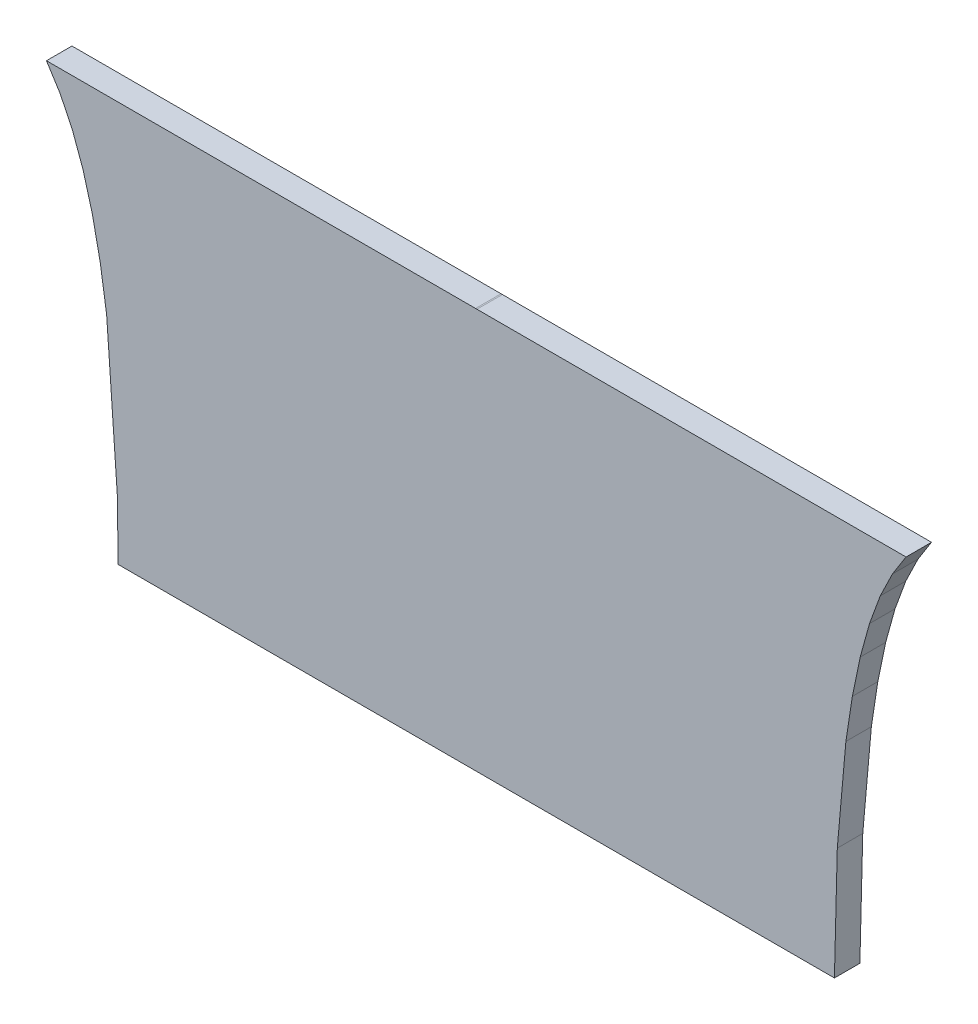
ISO-10303-21;
HEADER;
FILE_DESCRIPTION(('STEP AP214'),'2;1');
FILE_NAME('part.step','',(''),(''),'','','');
FILE_SCHEMA(('AUTOMOTIVE_DESIGN { 1 0 10303 214 1 1 1 1 }'));
ENDSEC;
DATA;
#1=APPLICATION_CONTEXT('core data for automotive mechanical design processes');
#2=APPLICATION_PROTOCOL_DEFINITION('international standard','automotive_design',2000,#1);
#3=PRODUCT_CONTEXT('',#1,'mechanical');
#4=PRODUCT('Part','Part','',(#3));
#5=PRODUCT_RELATED_PRODUCT_CATEGORY('part','',(#4));
#6=PRODUCT_DEFINITION_FORMATION('','',#4);
#7=PRODUCT_DEFINITION_CONTEXT('part definition',#1,'design');
#8=PRODUCT_DEFINITION('design','',#6,#7);
#9=PRODUCT_DEFINITION_SHAPE('','',#8);
#10=(LENGTH_UNIT() NAMED_UNIT(*) SI_UNIT(.MILLI.,.METRE.));
#11=(NAMED_UNIT(*) PLANE_ANGLE_UNIT() SI_UNIT($,.RADIAN.));
#12=(NAMED_UNIT(*) SI_UNIT($,.STERADIAN.) SOLID_ANGLE_UNIT());
#13=UNCERTAINTY_MEASURE_WITH_UNIT(LENGTH_MEASURE(1.E-05),#10,'distance_accuracy_value','');
#14=(GEOMETRIC_REPRESENTATION_CONTEXT(3) GLOBAL_UNCERTAINTY_ASSIGNED_CONTEXT((#13)) GLOBAL_UNIT_ASSIGNED_CONTEXT((#10,
#11,#12)) REPRESENTATION_CONTEXT('',''));
#15=CARTESIAN_POINT('',(0.,0.,0.));
#16=DIRECTION('',(0.,0.,1.));
#17=DIRECTION('',(1.,0.,0.));
#18=AXIS2_PLACEMENT_3D('',#15,#16,#17);
#19=CARTESIAN_POINT('',(68.4000015258789,42.5709991455078,0.));
#20=DIRECTION('',(0.,1.,0.));
#21=DIRECTION('',(1.,0.,0.));
#22=AXIS2_PLACEMENT_3D('',#19,#20,#21);
#23=PLANE('',#22);
#24=DIRECTION('',(1.,0.,0.));
#25=VECTOR('',#24,1.);
#26=CARTESIAN_POINT('',(68.4000015258789,42.5709991455078,0.03556));
#27=LINE('',#26,#25);
#28=CARTESIAN_POINT('',(68.4000015258789,42.5709991455078,0.03556));
#29=VERTEX_POINT('',#28);
#30=CARTESIAN_POINT('',(69.4000015258789,42.5709991455078,0.03556));
#31=VERTEX_POINT('',#30);
#32=EDGE_CURVE('E11',#29,#31,#27,.T.);
#33=ORIENTED_EDGE('',*,*,#32,.F.);
#34=DIRECTION('',(0.,0.,1.));
#35=VECTOR('',#34,1.);
#36=CARTESIAN_POINT('',(68.4000015258789,42.5709991455078,0.));
#37=LINE('',#36,#35);
#38=CARTESIAN_POINT('',(68.4000015258789,42.5709991455078,0.));
#39=VERTEX_POINT('',#38);
#40=EDGE_CURVE('E24',#39,#29,#37,.T.);
#41=ORIENTED_EDGE('',*,*,#40,.F.);
#42=DIRECTION('',(1.,0.,0.));
#43=VECTOR('',#42,1.);
#44=CARTESIAN_POINT('',(68.4000015258789,42.5709991455078,0.));
#45=LINE('',#44,#43);
#46=CARTESIAN_POINT('',(69.4000015258789,42.5709991455078,0.));
#47=VERTEX_POINT('',#46);
#48=EDGE_CURVE('E311',#39,#47,#45,.T.);
#49=ORIENTED_EDGE('',*,*,#48,.T.);
#50=DIRECTION('',(0.,0.,1.));
#51=VECTOR('',#50,1.);
#52=CARTESIAN_POINT('',(69.4000015258789,42.5709991455078,0.));
#53=LINE('',#52,#51);
#54=EDGE_CURVE('E37',#47,#31,#53,.T.);
#55=ORIENTED_EDGE('',*,*,#54,.T.);
#56=EDGE_LOOP('',(#33,#41,#49,#55));
#57=FACE_BOUND('',#56,.T.);
#58=ADVANCED_FACE('F17',(#57),#23,.F.);
#59=CARTESIAN_POINT('',(68.3990020751953,42.6529998779297,0.));
#60=DIRECTION('',(0.999925730774336,0.012187408888299,0.));
#61=DIRECTION('',(0.012187408888299,-0.999925730774336,0.));
#62=AXIS2_PLACEMENT_3D('',#59,#60,#61);
#63=PLANE('',#62);
#64=DIRECTION('',(0.012187408888299,-0.999925730774336,0.));
#65=VECTOR('',#64,1.);
#66=CARTESIAN_POINT('',(68.3990020751953,42.6529998779297,0.03556));
#67=LINE('',#66,#65);
#68=CARTESIAN_POINT('',(68.3990020751953,42.6529998779297,0.03556));
#69=VERTEX_POINT('',#68);
#70=EDGE_CURVE('E307',#69,#29,#67,.T.);
#71=ORIENTED_EDGE('',*,*,#70,.F.);
#72=DIRECTION('',(0.,0.,1.));
#73=VECTOR('',#72,1.);
#74=CARTESIAN_POINT('',(68.3990020751953,42.6529998779297,0.));
#75=LINE('',#74,#73);
#76=CARTESIAN_POINT('',(68.3990020751953,42.6529998779297,0.));
#77=VERTEX_POINT('',#76);
#78=EDGE_CURVE('E305',#77,#69,#75,.T.);
#79=ORIENTED_EDGE('',*,*,#78,.F.);
#80=DIRECTION('',(0.012187408888299,-0.999925730774336,0.));
#81=VECTOR('',#80,1.);
#82=CARTESIAN_POINT('',(68.3990020751953,42.6529998779297,0.));
#83=LINE('',#82,#81);
#84=EDGE_CURVE('E303',#77,#39,#83,.T.);
#85=ORIENTED_EDGE('',*,*,#84,.T.);
#86=ORIENTED_EDGE('',*,*,#40,.T.);
#87=EDGE_LOOP('',(#71,#79,#85,#86));
#88=FACE_BOUND('',#87,.T.);
#89=ADVANCED_FACE('F314',(#88),#63,.F.);
#90=CARTESIAN_POINT('',(68.3840026855469,42.8650016784668,0.));
#91=DIRECTION('',(0.997506488728673,0.0705748180599396,0.));
#92=DIRECTION('',(0.0705748180599396,-0.997506488728673,0.));
#93=AXIS2_PLACEMENT_3D('',#90,#91,#92);
#94=PLANE('',#93);
#95=DIRECTION('',(0.0705748180599396,-0.997506488728673,0.));
#96=VECTOR('',#95,1.);
#97=CARTESIAN_POINT('',(68.3840026855469,42.8650016784668,0.03556));
#98=LINE('',#97,#96);
#99=CARTESIAN_POINT('',(68.3840026855469,42.8650016784668,0.03556));
#100=VERTEX_POINT('',#99);
#101=EDGE_CURVE('E300',#100,#69,#98,.T.);
#102=ORIENTED_EDGE('',*,*,#101,.F.);
#103=DIRECTION('',(0.,0.,1.));
#104=VECTOR('',#103,1.);
#105=CARTESIAN_POINT('',(68.3840026855469,42.8650016784668,0.));
#106=LINE('',#105,#104);
#107=CARTESIAN_POINT('',(68.3840026855469,42.8650016784668,0.));
#108=VERTEX_POINT('',#107);
#109=EDGE_CURVE('E298',#108,#100,#106,.T.);
#110=ORIENTED_EDGE('',*,*,#109,.F.);
#111=DIRECTION('',(0.0705748180599396,-0.997506488728673,0.));
#112=VECTOR('',#111,1.);
#113=CARTESIAN_POINT('',(68.3840026855469,42.8650016784668,0.));
#114=LINE('',#113,#112);
#115=EDGE_CURVE('E295',#108,#77,#114,.T.);
#116=ORIENTED_EDGE('',*,*,#115,.T.);
#117=ORIENTED_EDGE('',*,*,#78,.T.);
#118=EDGE_LOOP('',(#102,#110,#116,#117));
#119=FACE_BOUND('',#118,.T.);
#120=ADVANCED_FACE('F317',(#119),#94,.F.);
#121=CARTESIAN_POINT('',(68.375,42.9239997863769,0.));
#122=DIRECTION('',(0.98855716875994,0.150846690694003,0.));
#123=DIRECTION('',(0.150846690694003,-0.98855716875994,0.));
#124=AXIS2_PLACEMENT_3D('',#121,#122,#123);
#125=PLANE('',#124);
#126=DIRECTION('',(0.150846690694003,-0.98855716875994,0.));
#127=VECTOR('',#126,1.);
#128=CARTESIAN_POINT('',(68.375,42.9239997863769,0.03556));
#129=LINE('',#128,#127);
#130=CARTESIAN_POINT('',(68.375,42.9239997863769,0.03556));
#131=VERTEX_POINT('',#130);
#132=EDGE_CURVE('E292',#131,#100,#129,.T.);
#133=ORIENTED_EDGE('',*,*,#132,.F.);
#134=DIRECTION('',(0.,0.,1.));
#135=VECTOR('',#134,1.);
#136=CARTESIAN_POINT('',(68.375,42.9239997863769,0.));
#137=LINE('',#136,#135);
#138=CARTESIAN_POINT('',(68.375,42.9239997863769,0.));
#139=VERTEX_POINT('',#138);
#140=EDGE_CURVE('E290',#139,#131,#137,.T.);
#141=ORIENTED_EDGE('',*,*,#140,.F.);
#142=DIRECTION('',(0.150846690694003,-0.98855716875994,0.));
#143=VECTOR('',#142,1.);
#144=CARTESIAN_POINT('',(68.375,42.9239997863769,0.));
#145=LINE('',#144,#143);
#146=EDGE_CURVE('E287',#139,#108,#145,.T.);
#147=ORIENTED_EDGE('',*,*,#146,.T.);
#148=ORIENTED_EDGE('',*,*,#109,.T.);
#149=EDGE_LOOP('',(#133,#141,#147,#148));
#150=FACE_BOUND('',#149,.T.);
#151=ADVANCED_FACE('F322',(#150),#125,.F.);
#152=CARTESIAN_POINT('',(68.3639984130859,42.9770011901855,0.));
#153=DIRECTION('',(0.979129074969474,0.203239402059303,0.));
#154=DIRECTION('',(0.203239402059303,-0.979129074969474,0.));
#155=AXIS2_PLACEMENT_3D('',#152,#153,#154);
#156=PLANE('',#155);
#157=DIRECTION('',(0.203239402059303,-0.979129074969473,0.));
#158=VECTOR('',#157,1.);
#159=CARTESIAN_POINT('',(68.3639984130859,42.9770011901855,0.03556));
#160=LINE('',#159,#158);
#161=CARTESIAN_POINT('',(68.3639984130859,42.9770011901855,0.03556));
#162=VERTEX_POINT('',#161);
#163=EDGE_CURVE('E284',#162,#131,#160,.T.);
#164=ORIENTED_EDGE('',*,*,#163,.F.);
#165=DIRECTION('',(0.,0.,1.));
#166=VECTOR('',#165,1.);
#167=CARTESIAN_POINT('',(68.3639984130859,42.9770011901855,0.));
#168=LINE('',#167,#166);
#169=CARTESIAN_POINT('',(68.3639984130859,42.9770011901855,0.));
#170=VERTEX_POINT('',#169);
#171=EDGE_CURVE('E282',#170,#162,#168,.T.);
#172=ORIENTED_EDGE('',*,*,#171,.F.);
#173=DIRECTION('',(0.203239402059303,-0.979129074969473,0.));
#174=VECTOR('',#173,1.);
#175=CARTESIAN_POINT('',(68.3639984130859,42.9770011901855,0.));
#176=LINE('',#175,#174);
#177=EDGE_CURVE('E279',#170,#139,#176,.T.);
#178=ORIENTED_EDGE('',*,*,#177,.T.);
#179=ORIENTED_EDGE('',*,*,#140,.T.);
#180=EDGE_LOOP('',(#164,#172,#178,#179));
#181=FACE_BOUND('',#180,.T.);
#182=ADVANCED_FACE('F325',(#181),#156,.F.);
#183=CARTESIAN_POINT('',(68.3509979248047,43.0239982604981,0.));
#184=DIRECTION('',(0.963804277203195,0.266610793564001,0.));
#185=DIRECTION('',(0.266610793564001,-0.963804277203195,0.));
#186=AXIS2_PLACEMENT_3D('',#183,#184,#185);
#187=PLANE('',#186);
#188=DIRECTION('',(0.266610793564001,-0.963804277203195,0.));
#189=VECTOR('',#188,1.);
#190=CARTESIAN_POINT('',(68.3509979248047,43.0239982604981,0.03556));
#191=LINE('',#190,#189);
#192=CARTESIAN_POINT('',(68.3509979248047,43.0239982604981,0.03556));
#193=VERTEX_POINT('',#192);
#194=EDGE_CURVE('E276',#193,#162,#191,.T.);
#195=ORIENTED_EDGE('',*,*,#194,.F.);
#196=DIRECTION('',(0.,0.,1.));
#197=VECTOR('',#196,1.);
#198=CARTESIAN_POINT('',(68.3509979248047,43.0239982604981,0.));
#199=LINE('',#198,#197);
#200=CARTESIAN_POINT('',(68.3509979248047,43.0239982604981,0.));
#201=VERTEX_POINT('',#200);
#202=EDGE_CURVE('E274',#201,#193,#199,.T.);
#203=ORIENTED_EDGE('',*,*,#202,.F.);
#204=DIRECTION('',(0.266610793564001,-0.963804277203195,0.));
#205=VECTOR('',#204,1.);
#206=CARTESIAN_POINT('',(68.3509979248047,43.0239982604981,0.));
#207=LINE('',#206,#205);
#208=EDGE_CURVE('E271',#201,#170,#207,.T.);
#209=ORIENTED_EDGE('',*,*,#208,.T.);
#210=ORIENTED_EDGE('',*,*,#171,.T.);
#211=EDGE_LOOP('',(#195,#203,#209,#210));
#212=FACE_BOUND('',#211,.T.);
#213=ADVANCED_FACE('F330',(#212),#187,.F.);
#214=CARTESIAN_POINT('',(68.3359985351562,43.064998626709,0.));
#215=DIRECTION('',(0.939128353177272,0.343566494668128,0.));
#216=DIRECTION('',(0.343566494668128,-0.939128353177272,0.));
#217=AXIS2_PLACEMENT_3D('',#214,#215,#216);
#218=PLANE('',#217);
#219=DIRECTION('',(0.343566494668128,-0.939128353177272,0.));
#220=VECTOR('',#219,1.);
#221=CARTESIAN_POINT('',(68.3359985351562,43.064998626709,0.03556));
#222=LINE('',#221,#220);
#223=CARTESIAN_POINT('',(68.3359985351562,43.064998626709,0.03556));
#224=VERTEX_POINT('',#223);
#225=EDGE_CURVE('E268',#224,#193,#222,.T.);
#226=ORIENTED_EDGE('',*,*,#225,.F.);
#227=DIRECTION('',(0.,0.,1.));
#228=VECTOR('',#227,1.);
#229=CARTESIAN_POINT('',(68.3359985351562,43.064998626709,0.));
#230=LINE('',#229,#228);
#231=CARTESIAN_POINT('',(68.3359985351562,43.064998626709,0.));
#232=VERTEX_POINT('',#231);
#233=EDGE_CURVE('E266',#232,#224,#230,.T.);
#234=ORIENTED_EDGE('',*,*,#233,.F.);
#235=DIRECTION('',(0.343566494668128,-0.939128353177272,0.));
#236=VECTOR('',#235,1.);
#237=CARTESIAN_POINT('',(68.3359985351562,43.064998626709,0.));
#238=LINE('',#237,#236);
#239=EDGE_CURVE('E263',#232,#201,#238,.T.);
#240=ORIENTED_EDGE('',*,*,#239,.T.);
#241=ORIENTED_EDGE('',*,*,#202,.T.);
#242=EDGE_LOOP('',(#226,#234,#240,#241));
#243=FACE_BOUND('',#242,.T.);
#244=ADVANCED_FACE('F333',(#243),#218,.F.);
#245=CARTESIAN_POINT('',(68.3190002441406,43.0999984741211,0.));
#246=DIRECTION('',(0.89952467075599,0.43686996543746,0.));
#247=DIRECTION('',(0.43686996543746,-0.89952467075599,0.));
#248=AXIS2_PLACEMENT_3D('',#245,#246,#247);
#249=PLANE('',#248);
#250=DIRECTION('',(0.43686996543746,-0.89952467075599,0.));
#251=VECTOR('',#250,1.);
#252=CARTESIAN_POINT('',(68.3190002441406,43.0999984741211,0.03556));
#253=LINE('',#252,#251);
#254=CARTESIAN_POINT('',(68.3190002441406,43.0999984741211,0.03556));
#255=VERTEX_POINT('',#254);
#256=EDGE_CURVE('E260',#255,#224,#253,.T.);
#257=ORIENTED_EDGE('',*,*,#256,.F.);
#258=DIRECTION('',(0.,0.,1.));
#259=VECTOR('',#258,1.);
#260=CARTESIAN_POINT('',(68.3190002441406,43.0999984741211,0.));
#261=LINE('',#260,#259);
#262=CARTESIAN_POINT('',(68.3190002441406,43.0999984741211,0.));
#263=VERTEX_POINT('',#262);
#264=EDGE_CURVE('E258',#263,#255,#261,.T.);
#265=ORIENTED_EDGE('',*,*,#264,.F.);
#266=DIRECTION('',(0.43686996543746,-0.89952467075599,0.));
#267=VECTOR('',#266,1.);
#268=CARTESIAN_POINT('',(68.3190002441406,43.0999984741211,0.));
#269=LINE('',#268,#267);
#270=EDGE_CURVE('E255',#263,#232,#269,.T.);
#271=ORIENTED_EDGE('',*,*,#270,.T.);
#272=ORIENTED_EDGE('',*,*,#233,.T.);
#273=EDGE_LOOP('',(#257,#265,#271,#272));
#274=FACE_BOUND('',#273,.T.);
#275=ADVANCED_FACE('F338',(#274),#249,.F.);
#276=CARTESIAN_POINT('',(68.3000030517578,43.1300010681152,0.));
#277=DIRECTION('',(0.844875720916496,0.534962630662956,0.));
#278=DIRECTION('',(0.534962630662956,-0.844875720916496,0.));
#279=AXIS2_PLACEMENT_3D('',#276,#277,#278);
#280=PLANE('',#279);
#281=DIRECTION('',(0.534962630662956,-0.844875720916496,0.));
#282=VECTOR('',#281,1.);
#283=CARTESIAN_POINT('',(68.3000030517578,43.1300010681152,0.03556));
#284=LINE('',#283,#282);
#285=CARTESIAN_POINT('',(68.3000030517578,43.1300010681152,0.03556));
#286=VERTEX_POINT('',#285);
#287=EDGE_CURVE('E252',#286,#255,#284,.T.);
#288=ORIENTED_EDGE('',*,*,#287,.F.);
#289=DIRECTION('',(0.,0.,1.));
#290=VECTOR('',#289,1.);
#291=CARTESIAN_POINT('',(68.3000030517578,43.1300010681152,0.));
#292=LINE('',#291,#290);
#293=CARTESIAN_POINT('',(68.3000030517578,43.1300010681152,0.));
#294=VERTEX_POINT('',#293);
#295=EDGE_CURVE('E250',#294,#286,#292,.T.);
#296=ORIENTED_EDGE('',*,*,#295,.F.);
#297=DIRECTION('',(0.534962630662956,-0.844875720916496,0.));
#298=VECTOR('',#297,1.);
#299=CARTESIAN_POINT('',(68.3000030517578,43.1300010681152,0.));
#300=LINE('',#299,#298);
#301=EDGE_CURVE('E247',#294,#263,#300,.T.);
#302=ORIENTED_EDGE('',*,*,#301,.T.);
#303=ORIENTED_EDGE('',*,*,#264,.T.);
#304=EDGE_LOOP('',(#288,#296,#302,#303));
#305=FACE_BOUND('',#304,.T.);
#306=ADVANCED_FACE('F341',(#305),#280,.F.);
#307=CARTESIAN_POINT('',(68.8990557649285,43.1300010681152,0.));
#308=DIRECTION('',(0.,-1.,0.));
#309=DIRECTION('',(-1.,0.,0.));
#310=AXIS2_PLACEMENT_3D('',#307,#308,#309);
#311=PLANE('',#310);
#312=DIRECTION('',(-1.,0.,0.));
#313=VECTOR('',#312,1.);
#314=CARTESIAN_POINT('',(69.5,43.1300010681152,0.03556));
#315=LINE('',#314,#313);
#316=CARTESIAN_POINT('',(68.8990557649285,43.1300010681152,0.03556));
#317=VERTEX_POINT('',#316);
#318=EDGE_CURVE('E244',#317,#286,#315,.T.);
#319=ORIENTED_EDGE('',*,*,#318,.F.);
#320=DIRECTION('',(0.,0.,1.));
#321=VECTOR('',#320,1.);
#322=CARTESIAN_POINT('',(68.8990557649285,43.1300010681152,0.));
#323=LINE('',#322,#321);
#324=CARTESIAN_POINT('',(68.8990557649285,43.1300010681152,0.));
#325=VERTEX_POINT('',#324);
#326=EDGE_CURVE('E242',#325,#317,#323,.T.);
#327=ORIENTED_EDGE('',*,*,#326,.F.);
#328=DIRECTION('',(-1.,0.,0.));
#329=VECTOR('',#328,1.);
#330=CARTESIAN_POINT('',(69.5,43.1300010681152,0.));
#331=LINE('',#330,#329);
#332=EDGE_CURVE('E239',#325,#294,#331,.T.);
#333=ORIENTED_EDGE('',*,*,#332,.T.);
#334=ORIENTED_EDGE('',*,*,#295,.T.);
#335=EDGE_LOOP('',(#319,#327,#333,#334));
#336=FACE_BOUND('',#335,.T.);
#337=ADVANCED_FACE('F346',(#336),#311,.F.);
#338=CARTESIAN_POINT('',(68.8999892,43.5799992,0.));
#339=DIRECTION('',(0.,0.,-1.));
#340=DIRECTION('',(1.,0.,0.));
#341=AXIS2_PLACEMENT_3D('',#338,#339,#340);
#342=CYLINDRICAL_SURFACE('',#341,0.4499991);
#343=ORIENTED_EDGE('',*,*,#326,.T.);
#344=CARTESIAN_POINT('',(68.8999892,43.5799992,0.03556));
#345=DIRECTION('',(0.,0.,1.));
#346=DIRECTION('',(1.,0.,0.));
#347=AXIS2_PLACEMENT_3D('',#344,#345,#346);
#348=CIRCLE('',#347,0.4499991);
#349=CARTESIAN_POINT('',(68.9009226350714,43.1300010681152,0.03556));
#350=VERTEX_POINT('',#349);
#351=EDGE_CURVE('E236',#317,#350,#348,.T.);
#352=ORIENTED_EDGE('',*,*,#351,.T.);
#353=DIRECTION('',(0.,0.,1.));
#354=VECTOR('',#353,1.);
#355=CARTESIAN_POINT('',(68.9009226350714,43.1300010681152,0.));
#356=LINE('',#355,#354);
#357=CARTESIAN_POINT('',(68.9009226350714,43.1300010681152,0.));
#358=VERTEX_POINT('',#357);
#359=EDGE_CURVE('E234',#358,#350,#356,.T.);
#360=ORIENTED_EDGE('',*,*,#359,.F.);
#361=CARTESIAN_POINT('',(68.8999892,43.5799992,0.));
#362=DIRECTION('',(0.,0.,1.));
#363=DIRECTION('',(1.,0.,0.));
#364=AXIS2_PLACEMENT_3D('',#361,#362,#363);
#365=CIRCLE('',#364,0.4499991);
#366=EDGE_CURVE('E231',#325,#358,#365,.T.);
#367=ORIENTED_EDGE('',*,*,#366,.F.);
#368=EDGE_LOOP('',(#343,#352,#360,#367));
#369=FACE_BOUND('',#368,.T.);
#370=ADVANCED_FACE('F349',(#369),#342,.F.);
#371=CARTESIAN_POINT('',(69.5,43.1300010681152,0.));
#372=DIRECTION('',(0.,-1.,0.));
#373=DIRECTION('',(-1.,0.,0.));
#374=AXIS2_PLACEMENT_3D('',#371,#372,#373);
#375=PLANE('',#374);
#376=DIRECTION('',(-1.,0.,0.));
#377=VECTOR('',#376,1.);
#378=CARTESIAN_POINT('',(69.5,43.1300010681152,0.03556));
#379=LINE('',#378,#377);
#380=CARTESIAN_POINT('',(69.5,43.1300010681152,0.03556));
#381=VERTEX_POINT('',#380);
#382=EDGE_CURVE('E228',#381,#350,#379,.T.);
#383=ORIENTED_EDGE('',*,*,#382,.F.);
#384=DIRECTION('',(0.,0.,1.));
#385=VECTOR('',#384,1.);
#386=CARTESIAN_POINT('',(69.5,43.1300010681152,0.));
#387=LINE('',#386,#385);
#388=CARTESIAN_POINT('',(69.5,43.1300010681152,0.));
#389=VERTEX_POINT('',#388);
#390=EDGE_CURVE('E226',#389,#381,#387,.T.);
#391=ORIENTED_EDGE('',*,*,#390,.F.);
#392=EDGE_CURVE('E225',#389,#358,#331,.T.);
#393=ORIENTED_EDGE('',*,*,#392,.T.);
#394=ORIENTED_EDGE('',*,*,#359,.T.);
#395=EDGE_LOOP('',(#383,#391,#393,#394));
#396=FACE_BOUND('',#395,.T.);
#397=ADVANCED_FACE('F355',(#396),#375,.F.);
#398=CARTESIAN_POINT('',(69.4810028076172,43.0999984741211,0.));
#399=DIRECTION('',(-0.844875720916496,0.534962630662956,0.));
#400=DIRECTION('',(0.534962630662956,0.844875720916496,0.));
#401=AXIS2_PLACEMENT_3D('',#398,#399,#400);
#402=PLANE('',#401);
#403=DIRECTION('',(0.534962630662956,0.844875720916496,0.));
#404=VECTOR('',#403,1.);
#405=CARTESIAN_POINT('',(69.4810028076172,43.0999984741211,0.03556));
#406=LINE('',#405,#404);
#407=CARTESIAN_POINT('',(69.4810028076172,43.0999984741211,0.03556));
#408=VERTEX_POINT('',#407);
#409=EDGE_CURVE('E222',#408,#381,#406,.T.);
#410=ORIENTED_EDGE('',*,*,#409,.F.);
#411=DIRECTION('',(0.,0.,1.));
#412=VECTOR('',#411,1.);
#413=CARTESIAN_POINT('',(69.4810028076172,43.0999984741211,0.));
#414=LINE('',#413,#412);
#415=CARTESIAN_POINT('',(69.4810028076172,43.0999984741211,0.));
#416=VERTEX_POINT('',#415);
#417=EDGE_CURVE('E220',#416,#408,#414,.T.);
#418=ORIENTED_EDGE('',*,*,#417,.F.);
#419=DIRECTION('',(0.534962630662956,0.844875720916496,0.));
#420=VECTOR('',#419,1.);
#421=CARTESIAN_POINT('',(69.4810028076172,43.0999984741211,0.));
#422=LINE('',#421,#420);
#423=EDGE_CURVE('E217',#416,#389,#422,.T.);
#424=ORIENTED_EDGE('',*,*,#423,.T.);
#425=ORIENTED_EDGE('',*,*,#390,.T.);
#426=EDGE_LOOP('',(#410,#418,#424,#425));
#427=FACE_BOUND('',#426,.T.);
#428=ADVANCED_FACE('F358',(#427),#402,.F.);
#429=CARTESIAN_POINT('',(69.463996887207,43.064998626709,0.));
#430=DIRECTION('',(-0.899447608111395,0.437028603483444,0.));
#431=DIRECTION('',(0.437028603483444,0.899447608111395,0.));
#432=AXIS2_PLACEMENT_3D('',#429,#430,#431);
#433=PLANE('',#432);
#434=DIRECTION('',(0.437028603483444,0.899447608111395,0.));
#435=VECTOR('',#434,1.);
#436=CARTESIAN_POINT('',(69.463996887207,43.064998626709,0.03556));
#437=LINE('',#436,#435);
#438=CARTESIAN_POINT('',(69.463996887207,43.064998626709,0.03556));
#439=VERTEX_POINT('',#438);
#440=EDGE_CURVE('E214',#439,#408,#437,.T.);
#441=ORIENTED_EDGE('',*,*,#440,.F.);
#442=DIRECTION('',(0.,0.,1.));
#443=VECTOR('',#442,1.);
#444=CARTESIAN_POINT('',(69.463996887207,43.064998626709,0.));
#445=LINE('',#444,#443);
#446=CARTESIAN_POINT('',(69.463996887207,43.064998626709,0.));
#447=VERTEX_POINT('',#446);
#448=EDGE_CURVE('E212',#447,#439,#445,.T.);
#449=ORIENTED_EDGE('',*,*,#448,.F.);
#450=DIRECTION('',(0.437028603483444,0.899447608111395,0.));
#451=VECTOR('',#450,1.);
#452=CARTESIAN_POINT('',(69.463996887207,43.064998626709,0.));
#453=LINE('',#452,#451);
#454=EDGE_CURVE('E209',#447,#416,#453,.T.);
#455=ORIENTED_EDGE('',*,*,#454,.T.);
#456=ORIENTED_EDGE('',*,*,#417,.T.);
#457=EDGE_LOOP('',(#441,#449,#455,#456));
#458=FACE_BOUND('',#457,.T.);
#459=ADVANCED_FACE('F363',(#458),#433,.F.);
#460=CARTESIAN_POINT('',(69.4489974975586,43.0239982604981,0.));
#461=DIRECTION('',(-0.939128353177272,0.343566494668128,0.));
#462=DIRECTION('',(0.343566494668128,0.939128353177272,0.));
#463=AXIS2_PLACEMENT_3D('',#460,#461,#462);
#464=PLANE('',#463);
#465=DIRECTION('',(0.343566494668128,0.939128353177272,0.));
#466=VECTOR('',#465,1.);
#467=CARTESIAN_POINT('',(69.4489974975586,43.0239982604981,0.03556));
#468=LINE('',#467,#466);
#469=CARTESIAN_POINT('',(69.4489974975586,43.0239982604981,0.03556));
#470=VERTEX_POINT('',#469);
#471=EDGE_CURVE('E206',#470,#439,#468,.T.);
#472=ORIENTED_EDGE('',*,*,#471,.F.);
#473=DIRECTION('',(0.,0.,1.));
#474=VECTOR('',#473,1.);
#475=CARTESIAN_POINT('',(69.4489974975586,43.0239982604981,0.));
#476=LINE('',#475,#474);
#477=CARTESIAN_POINT('',(69.4489974975586,43.0239982604981,0.));
#478=VERTEX_POINT('',#477);
#479=EDGE_CURVE('E204',#478,#470,#476,.T.);
#480=ORIENTED_EDGE('',*,*,#479,.F.);
#481=DIRECTION('',(0.343566494668128,0.939128353177272,0.));
#482=VECTOR('',#481,1.);
#483=CARTESIAN_POINT('',(69.4489974975586,43.0239982604981,0.));
#484=LINE('',#483,#482);
#485=EDGE_CURVE('E201',#478,#447,#484,.T.);
#486=ORIENTED_EDGE('',*,*,#485,.T.);
#487=ORIENTED_EDGE('',*,*,#448,.T.);
#488=EDGE_LOOP('',(#472,#480,#486,#487));
#489=FACE_BOUND('',#488,.T.);
#490=ADVANCED_FACE('F366',(#489),#464,.F.);
#491=CARTESIAN_POINT('',(69.4359970092773,42.9770011901855,0.));
#492=DIRECTION('',(-0.963804277203195,0.266610793564001,0.));
#493=DIRECTION('',(0.266610793564001,0.963804277203195,0.));
#494=AXIS2_PLACEMENT_3D('',#491,#492,#493);
#495=PLANE('',#494);
#496=DIRECTION('',(0.266610793564001,0.963804277203195,0.));
#497=VECTOR('',#496,1.);
#498=CARTESIAN_POINT('',(69.4359970092773,42.9770011901855,0.03556));
#499=LINE('',#498,#497);
#500=CARTESIAN_POINT('',(69.4359970092773,42.9770011901855,0.03556));
#501=VERTEX_POINT('',#500);
#502=EDGE_CURVE('E198',#501,#470,#499,.T.);
#503=ORIENTED_EDGE('',*,*,#502,.F.);
#504=DIRECTION('',(0.,0.,1.));
#505=VECTOR('',#504,1.);
#506=CARTESIAN_POINT('',(69.4359970092773,42.9770011901855,0.));
#507=LINE('',#506,#505);
#508=CARTESIAN_POINT('',(69.4359970092773,42.9770011901855,0.));
#509=VERTEX_POINT('',#508);
#510=EDGE_CURVE('E196',#509,#501,#507,.T.);
#511=ORIENTED_EDGE('',*,*,#510,.F.);
#512=DIRECTION('',(0.266610793564001,0.963804277203195,0.));
#513=VECTOR('',#512,1.);
#514=CARTESIAN_POINT('',(69.4359970092773,42.9770011901855,0.));
#515=LINE('',#514,#513);
#516=EDGE_CURVE('E193',#509,#478,#515,.T.);
#517=ORIENTED_EDGE('',*,*,#516,.T.);
#518=ORIENTED_EDGE('',*,*,#479,.T.);
#519=EDGE_LOOP('',(#503,#511,#517,#518));
#520=FACE_BOUND('',#519,.T.);
#521=ADVANCED_FACE('F370',(#520),#495,.F.);
#522=CARTESIAN_POINT('',(69.4250030517578,42.9239997863769,0.));
#523=DIRECTION('',(-0.979157113712778,0.203104275350527,0.));
#524=DIRECTION('',(0.203104275350527,0.979157113712778,0.));
#525=AXIS2_PLACEMENT_3D('',#522,#523,#524);
#526=PLANE('',#525);
#527=DIRECTION('',(0.203104275350527,0.979157113712778,0.));
#528=VECTOR('',#527,1.);
#529=CARTESIAN_POINT('',(69.4250030517578,42.9239997863769,0.03556));
#530=LINE('',#529,#528);
#531=CARTESIAN_POINT('',(69.4250030517578,42.9239997863769,0.03556));
#532=VERTEX_POINT('',#531);
#533=EDGE_CURVE('E190',#532,#501,#530,.T.);
#534=ORIENTED_EDGE('',*,*,#533,.F.);
#535=DIRECTION('',(0.,0.,1.));
#536=VECTOR('',#535,1.);
#537=CARTESIAN_POINT('',(69.4250030517578,42.9239997863769,0.));
#538=LINE('',#537,#536);
#539=CARTESIAN_POINT('',(69.4250030517578,42.9239997863769,0.));
#540=VERTEX_POINT('',#539);
#541=EDGE_CURVE('E188',#540,#532,#538,.T.);
#542=ORIENTED_EDGE('',*,*,#541,.F.);
#543=DIRECTION('',(0.203104275350527,0.979157113712778,0.));
#544=VECTOR('',#543,1.);
#545=CARTESIAN_POINT('',(69.4250030517578,42.9239997863769,0.));
#546=LINE('',#545,#544);
#547=EDGE_CURVE('E185',#540,#509,#546,.T.);
#548=ORIENTED_EDGE('',*,*,#547,.T.);
#549=ORIENTED_EDGE('',*,*,#510,.T.);
#550=EDGE_LOOP('',(#534,#542,#548,#549));
#551=FACE_BOUND('',#550,.T.);
#552=ADVANCED_FACE('F373',(#551),#526,.F.);
#553=CARTESIAN_POINT('',(69.4160003662109,42.8650016784668,0.));
#554=DIRECTION('',(-0.98855716875994,0.150846690694003,0.));
#555=DIRECTION('',(0.150846690694003,0.98855716875994,0.));
#556=AXIS2_PLACEMENT_3D('',#553,#554,#555);
#557=PLANE('',#556);
#558=DIRECTION('',(0.150846690694003,0.98855716875994,0.));
#559=VECTOR('',#558,1.);
#560=CARTESIAN_POINT('',(69.4160003662109,42.8650016784668,0.03556));
#561=LINE('',#560,#559);
#562=CARTESIAN_POINT('',(69.4160003662109,42.8650016784668,0.03556));
#563=VERTEX_POINT('',#562);
#564=EDGE_CURVE('E182',#563,#532,#561,.T.);
#565=ORIENTED_EDGE('',*,*,#564,.F.);
#566=DIRECTION('',(0.,0.,1.));
#567=VECTOR('',#566,1.);
#568=CARTESIAN_POINT('',(69.4160003662109,42.8650016784668,0.));
#569=LINE('',#568,#567);
#570=CARTESIAN_POINT('',(69.4160003662109,42.8650016784668,0.));
#571=VERTEX_POINT('',#570);
#572=EDGE_CURVE('E180',#571,#563,#569,.T.);
#573=ORIENTED_EDGE('',*,*,#572,.F.);
#574=DIRECTION('',(0.150846690694003,0.98855716875994,0.));
#575=VECTOR('',#574,1.);
#576=CARTESIAN_POINT('',(69.4160003662109,42.8650016784668,0.));
#577=LINE('',#576,#575);
#578=EDGE_CURVE('E171',#571,#540,#577,.T.);
#579=ORIENTED_EDGE('',*,*,#578,.T.);
#580=ORIENTED_EDGE('',*,*,#541,.T.);
#581=EDGE_LOOP('',(#565,#573,#579,#580));
#582=FACE_BOUND('',#581,.T.);
#583=ADVANCED_FACE('F376',(#582),#557,.F.);
#584=CARTESIAN_POINT('',(69.4039993286133,42.7299995422363,0.));
#585=DIRECTION('',(-0.996072089069625,0.0885459958240475,0.));
#586=DIRECTION('',(0.0885459958240475,0.996072089069625,0.));
#587=AXIS2_PLACEMENT_3D('',#584,#585,#586);
#588=PLANE('',#587);
#589=DIRECTION('',(0.0885459958240475,0.996072089069625,0.));
#590=VECTOR('',#589,1.);
#591=CARTESIAN_POINT('',(69.4039993286133,42.7299995422363,0.03556));
#592=LINE('',#591,#590);
#593=CARTESIAN_POINT('',(69.4039993286133,42.7299995422363,0.03556));
#594=VERTEX_POINT('',#593);
#595=EDGE_CURVE('E157',#594,#563,#592,.T.);
#596=ORIENTED_EDGE('',*,*,#595,.F.);
#597=DIRECTION('',(0.,0.,1.));
#598=VECTOR('',#597,1.);
#599=CARTESIAN_POINT('',(69.4039993286133,42.7299995422363,0.));
#600=LINE('',#599,#598);
#601=CARTESIAN_POINT('',(69.4039993286133,42.7299995422363,0.));
#602=VERTEX_POINT('',#601);
#603=EDGE_CURVE('E152',#602,#594,#600,.T.);
#604=ORIENTED_EDGE('',*,*,#603,.F.);
#605=DIRECTION('',(0.0885459958240475,0.996072089069625,0.));
#606=VECTOR('',#605,1.);
#607=CARTESIAN_POINT('',(69.4039993286133,42.7299995422363,0.));
#608=LINE('',#607,#606);
#609=EDGE_CURVE('E155',#602,#571,#608,.T.);
#610=ORIENTED_EDGE('',*,*,#609,.T.);
#611=ORIENTED_EDGE('',*,*,#572,.T.);
#612=EDGE_LOOP('',(#596,#604,#610,#611));
#613=FACE_BOUND('',#612,.T.);
#614=ADVANCED_FACE('F154',(#613),#588,.F.);
#615=CARTESIAN_POINT('',(69.4000015258789,42.5709991455078,0.));
#616=DIRECTION('',(-0.999684055752358,0.0251354067903474,0.));
#617=DIRECTION('',(0.0251354067903474,0.999684055752358,0.));
#618=AXIS2_PLACEMENT_3D('',#615,#616,#617);
#619=PLANE('',#618);
#620=DIRECTION('',(0.0251354067903474,0.999684055752358,0.));
#621=VECTOR('',#620,1.);
#622=CARTESIAN_POINT('',(69.4000015258789,42.5709991455078,0.03556));
#623=LINE('',#622,#621);
#624=EDGE_CURVE('E172',#31,#594,#623,.T.);
#625=ORIENTED_EDGE('',*,*,#624,.F.);
#626=ORIENTED_EDGE('',*,*,#54,.F.);
#627=DIRECTION('',(0.0251354067903474,0.999684055752358,0.));
#628=VECTOR('',#627,1.);
#629=CARTESIAN_POINT('',(69.4000015258789,42.5709991455078,0.));
#630=LINE('',#629,#628);
#631=EDGE_CURVE('E168',#47,#602,#630,.T.);
#632=ORIENTED_EDGE('',*,*,#631,.T.);
#633=ORIENTED_EDGE('',*,*,#603,.T.);
#634=EDGE_LOOP('',(#625,#626,#632,#633));
#635=FACE_BOUND('',#634,.T.);
#636=ADVANCED_FACE('F174',(#635),#619,.F.);
#637=CARTESIAN_POINT('',(69.4000015258789,42.5709991455078,0.));
#638=DIRECTION('',(0.,0.,1.));
#639=DIRECTION('',(1.,0.,0.));
#640=AXIS2_PLACEMENT_3D('',#637,#638,#639);
#641=PLANE('',#640);
#642=ORIENTED_EDGE('',*,*,#631,.F.);
#643=ORIENTED_EDGE('',*,*,#48,.F.);
#644=ORIENTED_EDGE('',*,*,#84,.F.);
#645=ORIENTED_EDGE('',*,*,#115,.F.);
#646=ORIENTED_EDGE('',*,*,#146,.F.);
#647=ORIENTED_EDGE('',*,*,#177,.F.);
#648=ORIENTED_EDGE('',*,*,#208,.F.);
#649=ORIENTED_EDGE('',*,*,#239,.F.);
#650=ORIENTED_EDGE('',*,*,#270,.F.);
#651=ORIENTED_EDGE('',*,*,#301,.F.);
#652=ORIENTED_EDGE('',*,*,#332,.F.);
#653=ORIENTED_EDGE('',*,*,#366,.T.);
#654=ORIENTED_EDGE('',*,*,#392,.F.);
#655=ORIENTED_EDGE('',*,*,#423,.F.);
#656=ORIENTED_EDGE('',*,*,#454,.F.);
#657=ORIENTED_EDGE('',*,*,#485,.F.);
#658=ORIENTED_EDGE('',*,*,#516,.F.);
#659=ORIENTED_EDGE('',*,*,#547,.F.);
#660=ORIENTED_EDGE('',*,*,#578,.F.);
#661=ORIENTED_EDGE('',*,*,#609,.F.);
#662=EDGE_LOOP('',(#642,#643,#644,#645,#646,#647,#648,#649,#650,#651,#652,#653,#654,#655,#656,
#657,#658,#659,#660,#661));
#663=FACE_BOUND('',#662,.T.);
#664=ADVANCED_FACE('F166',(#663),#641,.F.);
#665=CARTESIAN_POINT('',(69.4000015258789,42.5709991455078,0.03556));
#666=DIRECTION('',(0.,0.,1.));
#667=DIRECTION('',(1.,0.,0.));
#668=AXIS2_PLACEMENT_3D('',#665,#666,#667);
#669=PLANE('',#668);
#670=ORIENTED_EDGE('',*,*,#32,.T.);
#671=ORIENTED_EDGE('',*,*,#624,.T.);
#672=ORIENTED_EDGE('',*,*,#595,.T.);
#673=ORIENTED_EDGE('',*,*,#564,.T.);
#674=ORIENTED_EDGE('',*,*,#533,.T.);
#675=ORIENTED_EDGE('',*,*,#502,.T.);
#676=ORIENTED_EDGE('',*,*,#471,.T.);
#677=ORIENTED_EDGE('',*,*,#440,.T.);
#678=ORIENTED_EDGE('',*,*,#409,.T.);
#679=ORIENTED_EDGE('',*,*,#382,.T.);
#680=ORIENTED_EDGE('',*,*,#351,.F.);
#681=ORIENTED_EDGE('',*,*,#318,.T.);
#682=ORIENTED_EDGE('',*,*,#287,.T.);
#683=ORIENTED_EDGE('',*,*,#256,.T.);
#684=ORIENTED_EDGE('',*,*,#225,.T.);
#685=ORIENTED_EDGE('',*,*,#194,.T.);
#686=ORIENTED_EDGE('',*,*,#163,.T.);
#687=ORIENTED_EDGE('',*,*,#132,.T.);
#688=ORIENTED_EDGE('',*,*,#101,.T.);
#689=ORIENTED_EDGE('',*,*,#70,.T.);
#690=EDGE_LOOP('',(#670,#671,#672,#673,#674,#675,#676,#677,#678,#679,#680,#681,#682,#683,#684,
#685,#686,#687,#688,#689));
#691=FACE_BOUND('',#690,.T.);
#692=ADVANCED_FACE('F378',(#691),#669,.T.);
#693=CLOSED_SHELL('',(#58,#89,#120,#151,#182,#213,#244,#275,#306,#337,#370,#397,#428,#459,#490,
#521,#552,#583,#614,#636,#664,#692));
#694=MANIFOLD_SOLID_BREP('B1',#693);
#695=ADVANCED_BREP_SHAPE_REPRESENTATION('',(#18,#694),#14);
#696=SHAPE_DEFINITION_REPRESENTATION(#9,#695);
ENDSEC;
END-ISO-10303-21;
